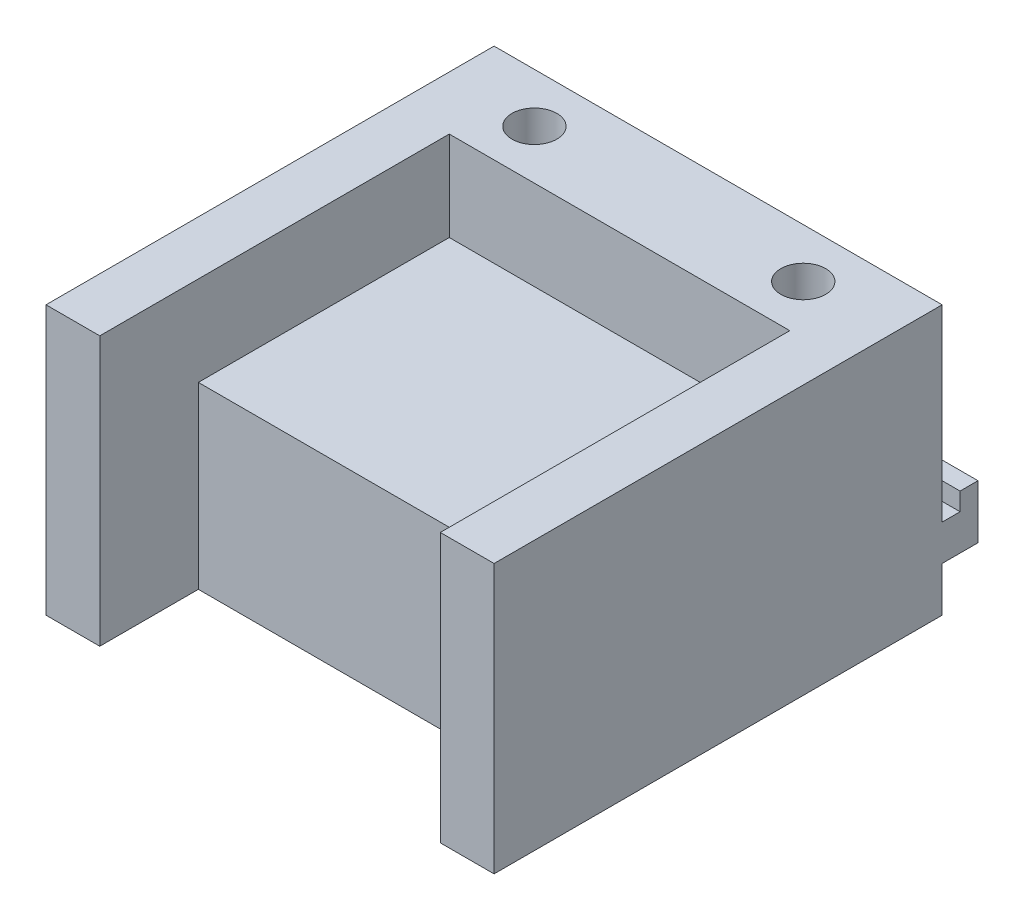
ISO-10303-21;
HEADER;
FILE_DESCRIPTION(('STEP AP214'),'2;1');
FILE_NAME('part.step','',(''),(''),'','','');
FILE_SCHEMA(('AUTOMOTIVE_DESIGN { 1 0 10303 214 1 1 1 1 }'));
ENDSEC;
DATA;
#1=APPLICATION_CONTEXT('core data for automotive mechanical design processes');
#2=APPLICATION_PROTOCOL_DEFINITION('international standard','automotive_design',2000,#1);
#3=PRODUCT_CONTEXT('',#1,'mechanical');
#4=PRODUCT('Part','Part','',(#3));
#5=PRODUCT_RELATED_PRODUCT_CATEGORY('part','',(#4));
#6=PRODUCT_DEFINITION_FORMATION('','',#4);
#7=PRODUCT_DEFINITION_CONTEXT('part definition',#1,'design');
#8=PRODUCT_DEFINITION('design','',#6,#7);
#9=PRODUCT_DEFINITION_SHAPE('','',#8);
#10=(LENGTH_UNIT() NAMED_UNIT(*) SI_UNIT(.MILLI.,.METRE.));
#11=(NAMED_UNIT(*) PLANE_ANGLE_UNIT() SI_UNIT($,.RADIAN.));
#12=(NAMED_UNIT(*) SI_UNIT($,.STERADIAN.) SOLID_ANGLE_UNIT());
#13=UNCERTAINTY_MEASURE_WITH_UNIT(LENGTH_MEASURE(1.E-05),#10,'distance_accuracy_value','');
#14=(GEOMETRIC_REPRESENTATION_CONTEXT(3) GLOBAL_UNCERTAINTY_ASSIGNED_CONTEXT((#13)) GLOBAL_UNIT_ASSIGNED_CONTEXT((#10,
#11,#12)) REPRESENTATION_CONTEXT('',''));
#15=CARTESIAN_POINT('',(0.,0.,0.));
#16=DIRECTION('',(0.,0.,1.));
#17=DIRECTION('',(1.,0.,0.));
#18=AXIS2_PLACEMENT_3D('',#15,#16,#17);
#19=CARTESIAN_POINT('',(-12.5,15.,-12.5));
#20=DIRECTION('',(0.,0.,1.));
#21=DIRECTION('',(1.,0.,0.));
#22=AXIS2_PLACEMENT_3D('',#19,#20,#21);
#23=PLANE('',#22);
#24=DIRECTION('',(1.,0.,0.));
#25=VECTOR('',#24,1.);
#26=CARTESIAN_POINT('',(-15.3284271247462,4.5,-12.5));
#27=LINE('',#26,#25);
#28=CARTESIAN_POINT('',(-12.5,4.5,-12.5));
#29=VERTEX_POINT('',#28);
#30=CARTESIAN_POINT('',(12.5,4.5,-12.5));
#31=VERTEX_POINT('',#30);
#32=EDGE_CURVE('E176',#29,#31,#27,.T.);
#33=ORIENTED_EDGE('',*,*,#32,.F.);
#34=DIRECTION('',(0.,-1.,0.));
#35=VECTOR('',#34,1.);
#36=CARTESIAN_POINT('',(-12.5,15.,-12.5));
#37=LINE('',#36,#35);
#38=CARTESIAN_POINT('',(-12.5,15.,-12.5));
#39=VERTEX_POINT('',#38);
#40=EDGE_CURVE('E270',#39,#29,#37,.T.);
#41=ORIENTED_EDGE('',*,*,#40,.F.);
#42=DIRECTION('',(-1.,0.,0.));
#43=VECTOR('',#42,1.);
#44=CARTESIAN_POINT('',(-12.5,15.,-12.5));
#45=LINE('',#44,#43);
#46=CARTESIAN_POINT('',(12.5,15.,-12.5));
#47=VERTEX_POINT('',#46);
#48=EDGE_CURVE('E248',#47,#39,#45,.T.);
#49=ORIENTED_EDGE('',*,*,#48,.F.);
#50=DIRECTION('',(0.,-1.,0.));
#51=VECTOR('',#50,1.);
#52=CARTESIAN_POINT('',(12.5,15.,-12.5));
#53=LINE('',#52,#51);
#54=EDGE_CURVE('E11',#47,#31,#53,.T.);
#55=ORIENTED_EDGE('',*,*,#54,.T.);
#56=EDGE_LOOP('',(#33,#41,#49,#55));
#57=FACE_BOUND('',#56,.T.);
#58=ADVANCED_FACE('F36',(#57),#23,.F.);
#59=CARTESIAN_POINT('',(-12.5,15.,12.5));
#60=DIRECTION('',(0.,0.,-1.));
#61=DIRECTION('',(-1.,0.,0.));
#62=AXIS2_PLACEMENT_3D('',#59,#60,#61);
#63=PLANE('',#62);
#64=DIRECTION('',(0.,-1.,0.));
#65=VECTOR('',#64,1.);
#66=CARTESIAN_POINT('',(-9.49999999999999,15.000012,12.5));
#67=LINE('',#66,#65);
#68=CARTESIAN_POINT('',(-9.49999999999999,15.,12.5));
#69=VERTEX_POINT('',#68);
#70=CARTESIAN_POINT('',(-9.49999999999999,0.,12.5));
#71=VERTEX_POINT('',#70);
#72=EDGE_CURVE('E214',#69,#71,#67,.T.);
#73=ORIENTED_EDGE('',*,*,#72,.F.);
#74=DIRECTION('',(1.,0.,0.));
#75=VECTOR('',#74,1.);
#76=CARTESIAN_POINT('',(-12.5,15.,12.5));
#77=LINE('',#76,#75);
#78=CARTESIAN_POINT('',(-12.5,15.,12.5));
#79=VERTEX_POINT('',#78);
#80=EDGE_CURVE('E254',#79,#69,#77,.T.);
#81=ORIENTED_EDGE('',*,*,#80,.F.);
#82=DIRECTION('',(0.,-1.,0.));
#83=VECTOR('',#82,1.);
#84=CARTESIAN_POINT('',(-12.5,15.,12.5));
#85=LINE('',#84,#83);
#86=CARTESIAN_POINT('',(-12.5,0.,12.5));
#87=VERTEX_POINT('',#86);
#88=EDGE_CURVE('E268',#79,#87,#85,.T.);
#89=ORIENTED_EDGE('',*,*,#88,.T.);
#90=DIRECTION('',(1.,0.,0.));
#91=VECTOR('',#90,1.);
#92=CARTESIAN_POINT('',(-12.5,0.,12.5));
#93=LINE('',#92,#91);
#94=EDGE_CURVE('E249',#87,#71,#93,.T.);
#95=ORIENTED_EDGE('',*,*,#94,.T.);
#96=EDGE_LOOP('',(#73,#81,#89,#95));
#97=FACE_BOUND('',#96,.T.);
#98=ADVANCED_FACE('F289',(#97),#63,.F.);
#99=CARTESIAN_POINT('',(12.5,15.,12.5));
#100=DIRECTION('',(-1.,0.,0.));
#101=DIRECTION('',(0.,0.,1.));
#102=AXIS2_PLACEMENT_3D('',#99,#100,#101);
#103=PLANE('',#102);
#104=DIRECTION('',(0.,0.,-1.));
#105=VECTOR('',#104,1.);
#106=CARTESIAN_POINT('',(12.5,0.,12.5));
#107=LINE('',#106,#105);
#108=CARTESIAN_POINT('',(12.5,0.,12.5));
#109=VERTEX_POINT('',#108);
#110=CARTESIAN_POINT('',(12.5,0.,-12.5));
#111=VERTEX_POINT('',#110);
#112=EDGE_CURVE('E242',#109,#111,#107,.T.);
#113=ORIENTED_EDGE('',*,*,#112,.T.);
#114=CARTESIAN_POINT('',(12.5,2.5,-12.5));
#115=VERTEX_POINT('',#114);
#116=EDGE_CURVE('E44',#115,#111,#53,.T.);
#117=ORIENTED_EDGE('',*,*,#116,.F.);
#118=DIRECTION('',(0.,0.,-1.));
#119=VECTOR('',#118,1.);
#120=CARTESIAN_POINT('',(12.5,2.5,-12.5));
#121=LINE('',#120,#119);
#122=CARTESIAN_POINT('',(12.5,2.5,-14.5));
#123=VERTEX_POINT('',#122);
#124=EDGE_CURVE('E181',#115,#123,#121,.T.);
#125=ORIENTED_EDGE('',*,*,#124,.T.);
#126=DIRECTION('',(0.,1.,0.));
#127=VECTOR('',#126,1.);
#128=CARTESIAN_POINT('',(12.5,2.5,-14.5));
#129=LINE('',#128,#127);
#130=CARTESIAN_POINT('',(12.5,5.5,-14.5));
#131=VERTEX_POINT('',#130);
#132=EDGE_CURVE('E177',#123,#131,#129,.T.);
#133=ORIENTED_EDGE('',*,*,#132,.T.);
#134=DIRECTION('',(0.,0.,1.));
#135=VECTOR('',#134,1.);
#136=CARTESIAN_POINT('',(12.5,5.5,-13.5));
#137=LINE('',#136,#135);
#138=CARTESIAN_POINT('',(12.5,5.5,-13.5));
#139=VERTEX_POINT('',#138);
#140=EDGE_CURVE('E166',#131,#139,#137,.T.);
#141=ORIENTED_EDGE('',*,*,#140,.T.);
#142=DIRECTION('',(0.,-1.,0.));
#143=VECTOR('',#142,1.);
#144=CARTESIAN_POINT('',(12.5,4.5,-13.5));
#145=LINE('',#144,#143);
#146=CARTESIAN_POINT('',(12.5,4.5,-13.5));
#147=VERTEX_POINT('',#146);
#148=EDGE_CURVE('E158',#139,#147,#145,.T.);
#149=ORIENTED_EDGE('',*,*,#148,.T.);
#150=DIRECTION('',(0.,0.,1.));
#151=VECTOR('',#150,1.);
#152=CARTESIAN_POINT('',(12.5,4.5,-12.5));
#153=LINE('',#152,#151);
#154=EDGE_CURVE('E171',#147,#31,#153,.T.);
#155=ORIENTED_EDGE('',*,*,#154,.T.);
#156=ORIENTED_EDGE('',*,*,#54,.F.);
#157=DIRECTION('',(0.,0.,-1.));
#158=VECTOR('',#157,1.);
#159=CARTESIAN_POINT('',(12.5,15.,12.5));
#160=LINE('',#159,#158);
#161=CARTESIAN_POINT('',(12.5,15.,12.5));
#162=VERTEX_POINT('',#161);
#163=EDGE_CURVE('E245',#162,#47,#160,.T.);
#164=ORIENTED_EDGE('',*,*,#163,.F.);
#165=DIRECTION('',(0.,-1.,0.));
#166=VECTOR('',#165,1.);
#167=CARTESIAN_POINT('',(12.5,15.,12.5));
#168=LINE('',#167,#166);
#169=EDGE_CURVE('E257',#162,#109,#168,.T.);
#170=ORIENTED_EDGE('',*,*,#169,.T.);
#171=EDGE_LOOP('',(#113,#117,#125,#133,#141,#149,#155,#156,#164,#170));
#172=FACE_BOUND('',#171,.T.);
#173=ADVANCED_FACE('F38',(#172),#103,.F.);
#174=CARTESIAN_POINT('',(-12.5,2.5,-12.5));
#175=VERTEX_POINT('',#174);
#176=CARTESIAN_POINT('',(-12.5,0.,-12.5));
#177=VERTEX_POINT('',#176);
#178=EDGE_CURVE('E56',#175,#177,#37,.T.);
#179=ORIENTED_EDGE('',*,*,#178,.F.);
#180=DIRECTION('',(1.,0.,0.));
#181=VECTOR('',#180,1.);
#182=CARTESIAN_POINT('',(-15.3284271247462,2.5,-12.5));
#183=LINE('',#182,#181);
#184=EDGE_CURVE('E51',#175,#115,#183,.T.);
#185=ORIENTED_EDGE('',*,*,#184,.T.);
#186=ORIENTED_EDGE('',*,*,#116,.T.);
#187=DIRECTION('',(-1.,0.,0.));
#188=VECTOR('',#187,1.);
#189=CARTESIAN_POINT('',(-12.5,0.,-12.5));
#190=LINE('',#189,#188);
#191=EDGE_CURVE('E259',#111,#177,#190,.T.);
#192=ORIENTED_EDGE('',*,*,#191,.T.);
#193=EDGE_LOOP('',(#179,#185,#186,#192));
#194=FACE_BOUND('',#193,.T.);
#195=ADVANCED_FACE('F280',(#194),#23,.F.);
#196=CARTESIAN_POINT('',(-12.5,15.,12.5));
#197=DIRECTION('',(1.,0.,0.));
#198=DIRECTION('',(0.,0.,-1.));
#199=AXIS2_PLACEMENT_3D('',#196,#197,#198);
#200=PLANE('',#199);
#201=DIRECTION('',(0.,0.,1.));
#202=VECTOR('',#201,1.);
#203=CARTESIAN_POINT('',(-12.5,0.,12.5));
#204=LINE('',#203,#202);
#205=EDGE_CURVE('E261',#177,#87,#204,.T.);
#206=ORIENTED_EDGE('',*,*,#205,.T.);
#207=ORIENTED_EDGE('',*,*,#88,.F.);
#208=DIRECTION('',(0.,0.,1.));
#209=VECTOR('',#208,1.);
#210=CARTESIAN_POINT('',(-12.5,15.,12.5));
#211=LINE('',#210,#209);
#212=EDGE_CURVE('E251',#39,#79,#211,.T.);
#213=ORIENTED_EDGE('',*,*,#212,.F.);
#214=ORIENTED_EDGE('',*,*,#40,.T.);
#215=DIRECTION('',(0.,0.,-1.));
#216=VECTOR('',#215,1.);
#217=CARTESIAN_POINT('',(-12.5,4.5,-12.5));
#218=LINE('',#217,#216);
#219=CARTESIAN_POINT('',(-12.5,4.5,-13.5));
#220=VERTEX_POINT('',#219);
#221=EDGE_CURVE('E191',#29,#220,#218,.T.);
#222=ORIENTED_EDGE('',*,*,#221,.T.);
#223=DIRECTION('',(0.,1.,0.));
#224=VECTOR('',#223,1.);
#225=CARTESIAN_POINT('',(-12.5,4.5,-13.5));
#226=LINE('',#225,#224);
#227=CARTESIAN_POINT('',(-12.5,5.5,-13.5));
#228=VERTEX_POINT('',#227);
#229=EDGE_CURVE('E160',#220,#228,#226,.T.);
#230=ORIENTED_EDGE('',*,*,#229,.T.);
#231=DIRECTION('',(0.,0.,-1.));
#232=VECTOR('',#231,1.);
#233=CARTESIAN_POINT('',(-12.5,5.5,-13.5));
#234=LINE('',#233,#232);
#235=CARTESIAN_POINT('',(-12.5,5.5,-14.5));
#236=VERTEX_POINT('',#235);
#237=EDGE_CURVE('E526',#228,#236,#234,.T.);
#238=ORIENTED_EDGE('',*,*,#237,.T.);
#239=DIRECTION('',(0.,-1.,0.));
#240=VECTOR('',#239,1.);
#241=CARTESIAN_POINT('',(-12.5,2.5,-14.5));
#242=LINE('',#241,#240);
#243=CARTESIAN_POINT('',(-12.5,2.5,-14.5));
#244=VERTEX_POINT('',#243);
#245=EDGE_CURVE('E186',#236,#244,#242,.T.);
#246=ORIENTED_EDGE('',*,*,#245,.T.);
#247=DIRECTION('',(0.,0.,1.));
#248=VECTOR('',#247,1.);
#249=CARTESIAN_POINT('',(-12.5,2.5,-12.5));
#250=LINE('',#249,#248);
#251=EDGE_CURVE('E188',#244,#175,#250,.T.);
#252=ORIENTED_EDGE('',*,*,#251,.T.);
#253=ORIENTED_EDGE('',*,*,#178,.T.);
#254=EDGE_LOOP('',(#206,#207,#213,#214,#222,#230,#238,#246,#252,#253));
#255=FACE_BOUND('',#254,.T.);
#256=ADVANCED_FACE('F275',(#255),#200,.F.);
#257=CARTESIAN_POINT('',(9.50000000000001,15.,12.5));
#258=VERTEX_POINT('',#257);
#259=EDGE_CURVE('E253',#258,#162,#77,.T.);
#260=ORIENTED_EDGE('',*,*,#259,.F.);
#261=DIRECTION('',(0.,-1.,0.));
#262=VECTOR('',#261,1.);
#263=CARTESIAN_POINT('',(9.50000000000001,15.000012,12.5));
#264=LINE('',#263,#262);
#265=CARTESIAN_POINT('',(9.50000000000001,0.,12.5));
#266=VERTEX_POINT('',#265);
#267=EDGE_CURVE('E211',#258,#266,#264,.T.);
#268=ORIENTED_EDGE('',*,*,#267,.T.);
#269=EDGE_CURVE('E263',#266,#109,#93,.T.);
#270=ORIENTED_EDGE('',*,*,#269,.T.);
#271=ORIENTED_EDGE('',*,*,#169,.F.);
#272=EDGE_LOOP('',(#260,#268,#270,#271));
#273=FACE_BOUND('',#272,.T.);
#274=ADVANCED_FACE('F300',(#273),#63,.F.);
#275=CARTESIAN_POINT('',(0.,15.,0.));
#276=DIRECTION('',(0.,-1.,0.));
#277=DIRECTION('',(0.,0.,-1.));
#278=AXIS2_PLACEMENT_3D('',#275,#276,#277);
#279=PLANE('',#278);
#280=CARTESIAN_POINT('',(-7.49999999999999,15.,-9.75000000000001));
#281=DIRECTION('',(0.,1.,0.));
#282=DIRECTION('',(0.,0.,1.));
#283=AXIS2_PLACEMENT_3D('',#280,#281,#282);
#284=CIRCLE('',#283,1.25);
#285=CARTESIAN_POINT('',(-7.49999999999999,15.,-8.50000000000001));
#286=VERTEX_POINT('',#285);
#287=EDGE_CURVE('E190',#286,#286,#284,.T.);
#288=ORIENTED_EDGE('',*,*,#287,.F.);
#289=EDGE_LOOP('',(#288));
#290=FACE_BOUND('',#289,.T.);
#291=CARTESIAN_POINT('',(7.50000000000001,15.,-9.75000000000001));
#292=DIRECTION('',(0.,1.,0.));
#293=DIRECTION('',(0.,0.,1.));
#294=AXIS2_PLACEMENT_3D('',#291,#292,#293);
#295=CIRCLE('',#294,1.25);
#296=CARTESIAN_POINT('',(7.50000000000001,15.,-8.50000000000001));
#297=VERTEX_POINT('',#296);
#298=EDGE_CURVE('E197',#297,#297,#295,.T.);
#299=ORIENTED_EDGE('',*,*,#298,.F.);
#300=EDGE_LOOP('',(#299));
#301=FACE_BOUND('',#300,.T.);
#302=DIRECTION('',(0.,0.,-1.));
#303=VECTOR('',#302,1.);
#304=CARTESIAN_POINT('',(9.50000000000001,15.,7.));
#305=LINE('',#304,#303);
#306=CARTESIAN_POINT('',(9.50000000000001,15.,-7.));
#307=VERTEX_POINT('',#306);
#308=EDGE_CURVE('E220',#258,#307,#305,.T.);
#309=ORIENTED_EDGE('',*,*,#308,.F.);
#310=ORIENTED_EDGE('',*,*,#259,.T.);
#311=ORIENTED_EDGE('',*,*,#163,.T.);
#312=ORIENTED_EDGE('',*,*,#48,.T.);
#313=ORIENTED_EDGE('',*,*,#212,.T.);
#314=ORIENTED_EDGE('',*,*,#80,.T.);
#315=DIRECTION('',(0.,0.,1.));
#316=VECTOR('',#315,1.);
#317=CARTESIAN_POINT('',(-9.49999999999999,15.,7.));
#318=LINE('',#317,#316);
#319=CARTESIAN_POINT('',(-9.49999999999999,15.,-7.));
#320=VERTEX_POINT('',#319);
#321=EDGE_CURVE('E225',#320,#69,#318,.T.);
#322=ORIENTED_EDGE('',*,*,#321,.F.);
#323=DIRECTION('',(-1.,0.,0.));
#324=VECTOR('',#323,1.);
#325=CARTESIAN_POINT('',(-9.49999999999999,15.,-7.));
#326=LINE('',#325,#324);
#327=EDGE_CURVE('E236',#307,#320,#326,.T.);
#328=ORIENTED_EDGE('',*,*,#327,.F.);
#329=EDGE_LOOP('',(#309,#310,#311,#312,#313,#314,#322,#328));
#330=FACE_BOUND('',#329,.T.);
#331=ADVANCED_FACE('F292',(#290,#301,#330),#279,.F.);
#332=CARTESIAN_POINT('',(0.,0.,0.));
#333=DIRECTION('',(0.,-1.,0.));
#334=DIRECTION('',(0.,0.,-1.));
#335=AXIS2_PLACEMENT_3D('',#332,#333,#334);
#336=PLANE('',#335);
#337=DIRECTION('',(0.,0.,1.));
#338=VECTOR('',#337,1.);
#339=CARTESIAN_POINT('',(9.50000000000001,0.,0.));
#340=LINE('',#339,#338);
#341=CARTESIAN_POINT('',(9.50000000000001,0.,7.));
#342=VERTEX_POINT('',#341);
#343=EDGE_CURVE('E203',#342,#266,#340,.T.);
#344=ORIENTED_EDGE('',*,*,#343,.F.);
#345=DIRECTION('',(-1.,0.,0.));
#346=VECTOR('',#345,1.);
#347=CARTESIAN_POINT('',(0.,0.,7.));
#348=LINE('',#347,#346);
#349=CARTESIAN_POINT('',(-9.49999999999999,0.,7.));
#350=VERTEX_POINT('',#349);
#351=EDGE_CURVE('E205',#342,#350,#348,.T.);
#352=ORIENTED_EDGE('',*,*,#351,.T.);
#353=DIRECTION('',(0.,0.,1.));
#354=VECTOR('',#353,1.);
#355=CARTESIAN_POINT('',(-9.49999999999999,0.,0.));
#356=LINE('',#355,#354);
#357=EDGE_CURVE('E208',#350,#71,#356,.T.);
#358=ORIENTED_EDGE('',*,*,#357,.T.);
#359=ORIENTED_EDGE('',*,*,#94,.F.);
#360=ORIENTED_EDGE('',*,*,#205,.F.);
#361=ORIENTED_EDGE('',*,*,#191,.F.);
#362=ORIENTED_EDGE('',*,*,#112,.F.);
#363=ORIENTED_EDGE('',*,*,#269,.F.);
#364=EDGE_LOOP('',(#344,#352,#358,#359,#360,#361,#362,#363));
#365=FACE_BOUND('',#364,.T.);
#366=ADVANCED_FACE('F285',(#365),#336,.T.);
#367=CARTESIAN_POINT('',(9.50000000000001,10.,7.));
#368=DIRECTION('',(1.,0.,0.));
#369=DIRECTION('',(0.,0.,-1.));
#370=AXIS2_PLACEMENT_3D('',#367,#368,#369);
#371=PLANE('',#370);
#372=ORIENTED_EDGE('',*,*,#308,.T.);
#373=DIRECTION('',(0.,1.,0.));
#374=VECTOR('',#373,1.);
#375=CARTESIAN_POINT('',(9.50000000000001,10.,-7.));
#376=LINE('',#375,#374);
#377=CARTESIAN_POINT('',(9.50000000000001,10.,-7.));
#378=VERTEX_POINT('',#377);
#379=EDGE_CURVE('E234',#378,#307,#376,.T.);
#380=ORIENTED_EDGE('',*,*,#379,.F.);
#381=DIRECTION('',(0.,0.,-1.));
#382=VECTOR('',#381,1.);
#383=CARTESIAN_POINT('',(9.50000000000001,10.,7.));
#384=LINE('',#383,#382);
#385=CARTESIAN_POINT('',(9.50000000000001,10.,7.));
#386=VERTEX_POINT('',#385);
#387=EDGE_CURVE('E221',#386,#378,#384,.T.);
#388=ORIENTED_EDGE('',*,*,#387,.F.);
#389=DIRECTION('',(0.,-1.,0.));
#390=VECTOR('',#389,1.);
#391=CARTESIAN_POINT('',(9.50000000000001,15.000012,7.));
#392=LINE('',#391,#390);
#393=EDGE_CURVE('E218',#386,#342,#392,.T.);
#394=ORIENTED_EDGE('',*,*,#393,.T.);
#395=ORIENTED_EDGE('',*,*,#343,.T.);
#396=ORIENTED_EDGE('',*,*,#267,.F.);
#397=EDGE_LOOP('',(#372,#380,#388,#394,#395,#396));
#398=FACE_BOUND('',#397,.T.);
#399=ADVANCED_FACE('F303',(#398),#371,.F.);
#400=CARTESIAN_POINT('',(-9.49999999999999,10.,7.));
#401=DIRECTION('',(-1.,0.,0.));
#402=DIRECTION('',(0.,0.,1.));
#403=AXIS2_PLACEMENT_3D('',#400,#401,#402);
#404=PLANE('',#403);
#405=ORIENTED_EDGE('',*,*,#321,.T.);
#406=ORIENTED_EDGE('',*,*,#72,.T.);
#407=ORIENTED_EDGE('',*,*,#357,.F.);
#408=DIRECTION('',(0.,-1.,0.));
#409=VECTOR('',#408,1.);
#410=CARTESIAN_POINT('',(-9.49999999999999,15.000012,7.));
#411=LINE('',#410,#409);
#412=CARTESIAN_POINT('',(-9.49999999999999,10.,7.));
#413=VERTEX_POINT('',#412);
#414=EDGE_CURVE('E216',#413,#350,#411,.T.);
#415=ORIENTED_EDGE('',*,*,#414,.F.);
#416=DIRECTION('',(0.,0.,1.));
#417=VECTOR('',#416,1.);
#418=CARTESIAN_POINT('',(-9.49999999999999,10.,7.));
#419=LINE('',#418,#417);
#420=CARTESIAN_POINT('',(-9.49999999999999,10.,-7.));
#421=VERTEX_POINT('',#420);
#422=EDGE_CURVE('E228',#421,#413,#419,.T.);
#423=ORIENTED_EDGE('',*,*,#422,.F.);
#424=DIRECTION('',(0.,1.,0.));
#425=VECTOR('',#424,1.);
#426=CARTESIAN_POINT('',(-9.49999999999999,10.,-7.));
#427=LINE('',#426,#425);
#428=EDGE_CURVE('E240',#421,#320,#427,.T.);
#429=ORIENTED_EDGE('',*,*,#428,.T.);
#430=EDGE_LOOP('',(#405,#406,#407,#415,#423,#429));
#431=FACE_BOUND('',#430,.T.);
#432=ADVANCED_FACE('F311',(#431),#404,.F.);
#433=CARTESIAN_POINT('',(-9.49999999999999,10.,-7.));
#434=DIRECTION('',(0.,0.,-1.));
#435=DIRECTION('',(-1.,0.,0.));
#436=AXIS2_PLACEMENT_3D('',#433,#434,#435);
#437=PLANE('',#436);
#438=ORIENTED_EDGE('',*,*,#327,.T.);
#439=ORIENTED_EDGE('',*,*,#428,.F.);
#440=DIRECTION('',(-1.,0.,0.));
#441=VECTOR('',#440,1.);
#442=CARTESIAN_POINT('',(-9.49999999999999,10.,-7.));
#443=LINE('',#442,#441);
#444=EDGE_CURVE('E224',#378,#421,#443,.T.);
#445=ORIENTED_EDGE('',*,*,#444,.F.);
#446=ORIENTED_EDGE('',*,*,#379,.T.);
#447=EDGE_LOOP('',(#438,#439,#445,#446));
#448=FACE_BOUND('',#447,.T.);
#449=ADVANCED_FACE('F314',(#448),#437,.F.);
#450=CARTESIAN_POINT('',(0.,10.,0.));
#451=DIRECTION('',(0.,-1.,0.));
#452=DIRECTION('',(0.,0.,-1.));
#453=AXIS2_PLACEMENT_3D('',#450,#451,#452);
#454=PLANE('',#453);
#455=ORIENTED_EDGE('',*,*,#387,.T.);
#456=ORIENTED_EDGE('',*,*,#444,.T.);
#457=ORIENTED_EDGE('',*,*,#422,.T.);
#458=DIRECTION('',(1.,0.,0.));
#459=VECTOR('',#458,1.);
#460=CARTESIAN_POINT('',(-9.49999999999999,10.,7.));
#461=LINE('',#460,#459);
#462=EDGE_CURVE('E231',#413,#386,#461,.T.);
#463=ORIENTED_EDGE('',*,*,#462,.T.);
#464=EDGE_LOOP('',(#455,#456,#457,#463));
#465=FACE_BOUND('',#464,.T.);
#466=ADVANCED_FACE('F317',(#465),#454,.F.);
#467=CARTESIAN_POINT('',(0.,15.000012,7.));
#468=DIRECTION('',(0.,0.,1.));
#469=DIRECTION('',(1.,0.,0.));
#470=AXIS2_PLACEMENT_3D('',#467,#468,#469);
#471=PLANE('',#470);
#472=ORIENTED_EDGE('',*,*,#462,.F.);
#473=ORIENTED_EDGE('',*,*,#414,.T.);
#474=ORIENTED_EDGE('',*,*,#351,.F.);
#475=ORIENTED_EDGE('',*,*,#393,.F.);
#476=EDGE_LOOP('',(#472,#473,#474,#475));
#477=FACE_BOUND('',#476,.T.);
#478=ADVANCED_FACE('F307',(#477),#471,.T.);
#479=CARTESIAN_POINT('',(7.50000000000001,10.,-9.75000000000001));
#480=DIRECTION('',(0.,1.,0.));
#481=DIRECTION('',(0.,0.,1.));
#482=AXIS2_PLACEMENT_3D('',#479,#480,#481);
#483=CONICAL_SURFACE('',#482,1.25,1.02974425867665);
#484=CARTESIAN_POINT('',(7.50000000000001,9.24892422621555,-9.75000000000001));
#485=VERTEX_POINT('',#484);
#486=VERTEX_LOOP('',#485);
#487=FACE_BOUND('',#486,.T.);
#488=CARTESIAN_POINT('',(7.50000000000001,10.,-9.75000000000001));
#489=DIRECTION('',(0.,1.,0.));
#490=DIRECTION('',(0.,0.,1.));
#491=AXIS2_PLACEMENT_3D('',#488,#489,#490);
#492=CIRCLE('',#491,1.25);
#493=CARTESIAN_POINT('',(7.50000000000001,10.,-8.50000000000001));
#494=VERTEX_POINT('',#493);
#495=EDGE_CURVE('E200',#494,#494,#492,.T.);
#496=ORIENTED_EDGE('',*,*,#495,.T.);
#497=EDGE_LOOP('',(#496));
#498=FACE_BOUND('',#497,.T.);
#499=ADVANCED_FACE('F324',(#487,#498),#483,.F.);
#500=CARTESIAN_POINT('',(7.50000000000001,15.,-9.75000000000001));
#501=DIRECTION('',(0.,1.,0.));
#502=DIRECTION('',(0.,0.,1.));
#503=AXIS2_PLACEMENT_3D('',#500,#501,#502);
#504=CYLINDRICAL_SURFACE('',#503,1.25);
#505=ORIENTED_EDGE('',*,*,#495,.F.);
#506=EDGE_LOOP('',(#505));
#507=FACE_BOUND('',#506,.T.);
#508=ORIENTED_EDGE('',*,*,#298,.T.);
#509=EDGE_LOOP('',(#508));
#510=FACE_BOUND('',#509,.T.);
#511=ADVANCED_FACE('F411',(#507,#510),#504,.F.);
#512=CARTESIAN_POINT('',(-7.49999999999999,10.,-9.75000000000001));
#513=DIRECTION('',(0.,1.,0.));
#514=DIRECTION('',(0.,0.,1.));
#515=AXIS2_PLACEMENT_3D('',#512,#513,#514);
#516=CONICAL_SURFACE('',#515,1.25,1.02974425867665);
#517=CARTESIAN_POINT('',(-7.5,9.24892422621555,-9.75000000000001));
#518=VERTEX_POINT('',#517);
#519=VERTEX_LOOP('',#518);
#520=FACE_BOUND('',#519,.T.);
#521=CARTESIAN_POINT('',(-7.49999999999999,10.,-9.75000000000001));
#522=DIRECTION('',(0.,1.,0.));
#523=DIRECTION('',(0.,0.,1.));
#524=AXIS2_PLACEMENT_3D('',#521,#522,#523);
#525=CIRCLE('',#524,1.25);
#526=CARTESIAN_POINT('',(-7.49999999999999,10.,-8.50000000000001));
#527=VERTEX_POINT('',#526);
#528=EDGE_CURVE('E194',#527,#527,#525,.T.);
#529=ORIENTED_EDGE('',*,*,#528,.T.);
#530=EDGE_LOOP('',(#529));
#531=FACE_BOUND('',#530,.T.);
#532=ADVANCED_FACE('F421',(#520,#531),#516,.F.);
#533=CARTESIAN_POINT('',(-7.49999999999999,15.,-9.75000000000001));
#534=DIRECTION('',(0.,1.,0.));
#535=DIRECTION('',(0.,0.,1.));
#536=AXIS2_PLACEMENT_3D('',#533,#534,#535);
#537=CYLINDRICAL_SURFACE('',#536,1.25);
#538=ORIENTED_EDGE('',*,*,#528,.F.);
#539=EDGE_LOOP('',(#538));
#540=FACE_BOUND('',#539,.T.);
#541=ORIENTED_EDGE('',*,*,#287,.T.);
#542=EDGE_LOOP('',(#541));
#543=FACE_BOUND('',#542,.T.);
#544=ADVANCED_FACE('F431',(#540,#543),#537,.F.);
#545=CARTESIAN_POINT('',(-15.3284271247462,4.5,-12.5));
#546=DIRECTION('',(0.,1.,0.));
#547=DIRECTION('',(0.,0.,1.));
#548=AXIS2_PLACEMENT_3D('',#545,#546,#547);
#549=PLANE('',#548);
#550=DIRECTION('',(1.,0.,0.));
#551=VECTOR('',#550,1.);
#552=CARTESIAN_POINT('',(-13.9142135623731,4.5,-13.5));
#553=LINE('',#552,#551);
#554=EDGE_CURVE('E154',#220,#147,#553,.T.);
#555=ORIENTED_EDGE('',*,*,#554,.F.);
#556=ORIENTED_EDGE('',*,*,#221,.F.);
#557=ORIENTED_EDGE('',*,*,#32,.T.);
#558=ORIENTED_EDGE('',*,*,#154,.F.);
#559=EDGE_LOOP('',(#555,#556,#557,#558));
#560=FACE_BOUND('',#559,.T.);
#561=ADVANCED_FACE('F175',(#560),#549,.T.);
#562=CARTESIAN_POINT('',(-15.3284271247462,2.5,-14.5));
#563=DIRECTION('',(0.,0.,-1.));
#564=DIRECTION('',(-1.,0.,0.));
#565=AXIS2_PLACEMENT_3D('',#562,#563,#564);
#566=PLANE('',#565);
#567=ORIENTED_EDGE('',*,*,#245,.F.);
#568=DIRECTION('',(1.,0.,0.));
#569=VECTOR('',#568,1.);
#570=CARTESIAN_POINT('',(-13.9142135623731,5.5,-14.5));
#571=LINE('',#570,#569);
#572=EDGE_CURVE('E165',#236,#131,#571,.T.);
#573=ORIENTED_EDGE('',*,*,#572,.T.);
#574=ORIENTED_EDGE('',*,*,#132,.F.);
#575=DIRECTION('',(1.,0.,0.));
#576=VECTOR('',#575,1.);
#577=CARTESIAN_POINT('',(-15.3284271247462,2.5,-14.5));
#578=LINE('',#577,#576);
#579=EDGE_CURVE('E179',#244,#123,#578,.T.);
#580=ORIENTED_EDGE('',*,*,#579,.F.);
#581=EDGE_LOOP('',(#567,#573,#574,#580));
#582=FACE_BOUND('',#581,.T.);
#583=ADVANCED_FACE('F460',(#582),#566,.T.);
#584=CARTESIAN_POINT('',(-15.3284271247462,2.5,-12.5));
#585=DIRECTION('',(0.,-1.,0.));
#586=DIRECTION('',(0.,0.,-1.));
#587=AXIS2_PLACEMENT_3D('',#584,#585,#586);
#588=PLANE('',#587);
#589=ORIENTED_EDGE('',*,*,#251,.F.);
#590=ORIENTED_EDGE('',*,*,#579,.T.);
#591=ORIENTED_EDGE('',*,*,#124,.F.);
#592=ORIENTED_EDGE('',*,*,#184,.F.);
#593=EDGE_LOOP('',(#589,#590,#591,#592));
#594=FACE_BOUND('',#593,.T.);
#595=ADVANCED_FACE('F456',(#594),#588,.T.);
#596=CARTESIAN_POINT('',(-13.9142135623731,4.5,-13.5));
#597=DIRECTION('',(0.,0.,1.));
#598=DIRECTION('',(1.,0.,0.));
#599=AXIS2_PLACEMENT_3D('',#596,#597,#598);
#600=PLANE('',#599);
#601=ORIENTED_EDGE('',*,*,#229,.F.);
#602=ORIENTED_EDGE('',*,*,#554,.T.);
#603=ORIENTED_EDGE('',*,*,#148,.F.);
#604=DIRECTION('',(1.,0.,0.));
#605=VECTOR('',#604,1.);
#606=CARTESIAN_POINT('',(-13.9142135623731,5.5,-13.5));
#607=LINE('',#606,#605);
#608=EDGE_CURVE('E527',#228,#139,#607,.T.);
#609=ORIENTED_EDGE('',*,*,#608,.F.);
#610=EDGE_LOOP('',(#601,#602,#603,#609));
#611=FACE_BOUND('',#610,.T.);
#612=ADVANCED_FACE('F156',(#611),#600,.T.);
#613=CARTESIAN_POINT('',(-13.9142135623731,5.5,-13.5));
#614=DIRECTION('',(0.,1.,0.));
#615=DIRECTION('',(0.,0.,1.));
#616=AXIS2_PLACEMENT_3D('',#613,#614,#615);
#617=PLANE('',#616);
#618=ORIENTED_EDGE('',*,*,#237,.F.);
#619=ORIENTED_EDGE('',*,*,#608,.T.);
#620=ORIENTED_EDGE('',*,*,#140,.F.);
#621=ORIENTED_EDGE('',*,*,#572,.F.);
#622=EDGE_LOOP('',(#618,#619,#620,#621));
#623=FACE_BOUND('',#622,.T.);
#624=ADVANCED_FACE('F474',(#623),#617,.T.);
#625=CLOSED_SHELL('',(#58,#98,#173,#195,#256,#274,#331,#366,#399,#432,#449,#466,#478,#499,#511,
#532,#544,#561,#583,#595,#612,#624));
#626=MANIFOLD_SOLID_BREP('B2',#625);
#627=ADVANCED_BREP_SHAPE_REPRESENTATION('',(#18,#626),#14);
#628=SHAPE_DEFINITION_REPRESENTATION(#9,#627);
ENDSEC;
END-ISO-10303-21;
